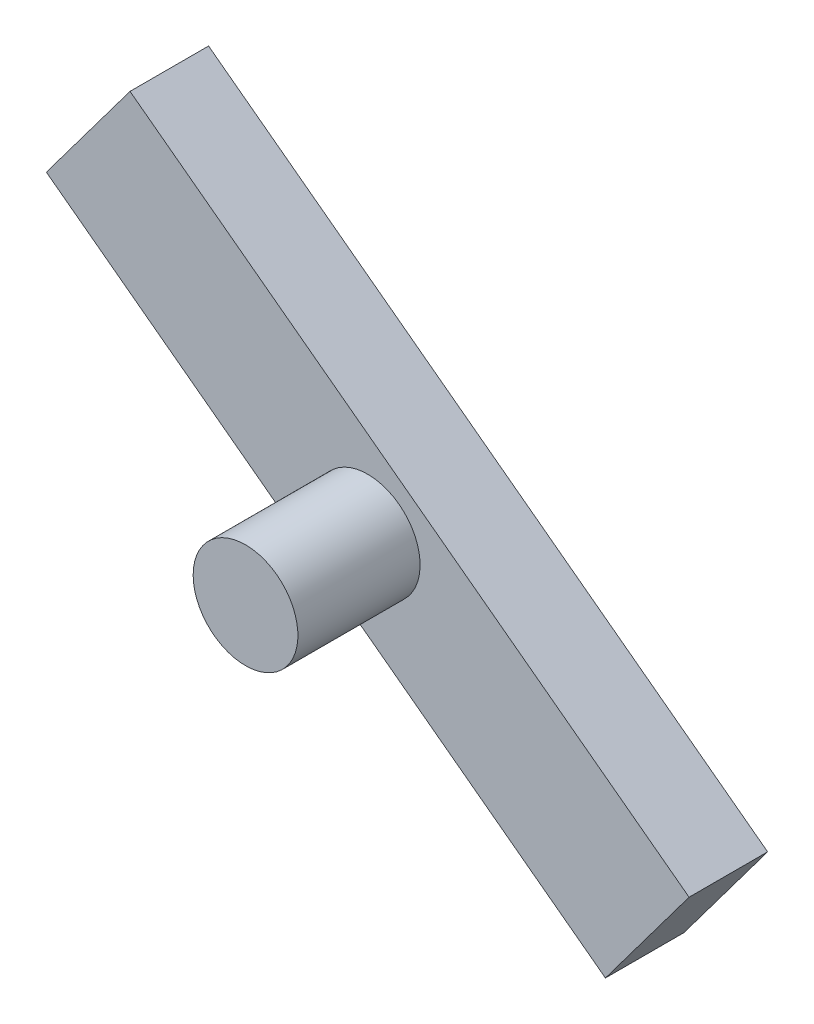
ISO-10303-21;
HEADER;
FILE_DESCRIPTION(('STEP AP214'),'2;1');
FILE_NAME('part.step','',(''),(''),'','','');
FILE_SCHEMA(('AUTOMOTIVE_DESIGN { 1 0 10303 214 1 1 1 1 }'));
ENDSEC;
DATA;
#1=APPLICATION_CONTEXT('core data for automotive mechanical design processes');
#2=APPLICATION_PROTOCOL_DEFINITION('international standard','automotive_design',2000,#1);
#3=PRODUCT_CONTEXT('',#1,'mechanical');
#4=PRODUCT('Part','Part','',(#3));
#5=PRODUCT_RELATED_PRODUCT_CATEGORY('part','',(#4));
#6=PRODUCT_DEFINITION_FORMATION('','',#4);
#7=PRODUCT_DEFINITION_CONTEXT('part definition',#1,'design');
#8=PRODUCT_DEFINITION('design','',#6,#7);
#9=PRODUCT_DEFINITION_SHAPE('','',#8);
#10=(LENGTH_UNIT() NAMED_UNIT(*) SI_UNIT(.MILLI.,.METRE.));
#11=(NAMED_UNIT(*) PLANE_ANGLE_UNIT() SI_UNIT($,.RADIAN.));
#12=(NAMED_UNIT(*) SI_UNIT($,.STERADIAN.) SOLID_ANGLE_UNIT());
#13=UNCERTAINTY_MEASURE_WITH_UNIT(LENGTH_MEASURE(1.E-05),#10,'distance_accuracy_value','');
#14=(GEOMETRIC_REPRESENTATION_CONTEXT(3) GLOBAL_UNCERTAINTY_ASSIGNED_CONTEXT((#13)) GLOBAL_UNIT_ASSIGNED_CONTEXT((#10,
#11,#12)) REPRESENTATION_CONTEXT('',''));
#15=CARTESIAN_POINT('',(0.,0.,0.));
#16=DIRECTION('',(0.,0.,1.));
#17=DIRECTION('',(1.,0.,0.));
#18=AXIS2_PLACEMENT_3D('',#15,#16,#17);
#19=CARTESIAN_POINT('',(-263.128358849387,316.504901667894,22.));
#20=DIRECTION('',(0.,0.,-1.));
#21=DIRECTION('',(-1.,0.,0.));
#22=AXIS2_PLACEMENT_3D('',#19,#20,#21);
#23=PLANE('',#22);
#24=CARTESIAN_POINT('',(-263.128358849387,316.504901667894,22.));
#25=DIRECTION('',(0.,0.,-1.));
#26=DIRECTION('',(-1.,0.,0.));
#27=AXIS2_PLACEMENT_3D('',#24,#25,#26);
#28=CIRCLE('',#27,3.);
#29=CARTESIAN_POINT('',(-266.128358849387,316.504901667894,22.));
#30=VERTEX_POINT('',#29);
#31=EDGE_CURVE('E47',#30,#30,#28,.T.);
#32=ORIENTED_EDGE('',*,*,#31,.F.);
#33=EDGE_LOOP('',(#32));
#34=FACE_BOUND('',#33,.T.);
#35=ADVANCED_FACE('F39',(#34),#23,.F.);
#36=CARTESIAN_POINT('',(-263.128358849387,316.504901667894,22.));
#37=DIRECTION('',(0.,0.,-1.));
#38=DIRECTION('',(-1.,0.,0.));
#39=AXIS2_PLACEMENT_3D('',#36,#37,#38);
#40=CYLINDRICAL_SURFACE('',#39,3.);
#41=CARTESIAN_POINT('',(-263.128358849387,316.504901667894,15.));
#42=DIRECTION('',(0.,0.,-1.));
#43=DIRECTION('',(-1.,0.,0.));
#44=AXIS2_PLACEMENT_3D('',#41,#42,#43);
#45=CIRCLE('',#44,3.);
#46=CARTESIAN_POINT('',(-266.128358849387,316.504901667894,15.));
#47=VERTEX_POINT('',#46);
#48=EDGE_CURVE('E12',#47,#47,#45,.T.);
#49=ORIENTED_EDGE('',*,*,#48,.F.);
#50=EDGE_LOOP('',(#49));
#51=FACE_BOUND('',#50,.T.);
#52=ORIENTED_EDGE('',*,*,#31,.T.);
#53=EDGE_LOOP('',(#52));
#54=FACE_BOUND('',#53,.T.);
#55=ADVANCED_FACE('F117',(#51,#54),#40,.T.);
#56=CARTESIAN_POINT('',(-281.537950913536,325.28481738683,15.));
#57=DIRECTION('',(0.599126640950297,0.800654275017385,0.));
#58=DIRECTION('',(-0.800654275017385,0.599126640950297,0.));
#59=AXIS2_PLACEMENT_3D('',#56,#57,#58);
#60=PLANE('',#59);
#61=DIRECTION('',(0.800654275017385,-0.599126640950297,0.));
#62=VECTOR('',#61,1.);
#63=CARTESIAN_POINT('',(-281.537950913536,325.28481738683,10.5));
#64=LINE('',#63,#62);
#65=CARTESIAN_POINT('',(-281.537950913536,325.28481738683,10.5));
#66=VERTEX_POINT('',#65);
#67=CARTESIAN_POINT('',(-249.51177991284,301.319751748818,10.5));
#68=VERTEX_POINT('',#67);
#69=EDGE_CURVE('E106',#66,#68,#64,.T.);
#70=ORIENTED_EDGE('',*,*,#69,.T.);
#71=DIRECTION('',(0.,0.,-1.));
#72=VECTOR('',#71,1.);
#73=CARTESIAN_POINT('',(-249.51177991284,301.319751748818,15.));
#74=LINE('',#73,#72);
#75=CARTESIAN_POINT('',(-249.51177991284,301.319751748818,15.));
#76=VERTEX_POINT('',#75);
#77=EDGE_CURVE('E97',#76,#68,#74,.T.);
#78=ORIENTED_EDGE('',*,*,#77,.F.);
#79=DIRECTION('',(0.800654275017385,-0.599126640950297,0.));
#80=VECTOR('',#79,1.);
#81=CARTESIAN_POINT('',(-281.537950913536,325.28481738683,15.));
#82=LINE('',#81,#80);
#83=CARTESIAN_POINT('',(-281.537950913536,325.28481738683,15.));
#84=VERTEX_POINT('',#83);
#85=EDGE_CURVE('E91',#84,#76,#82,.T.);
#86=ORIENTED_EDGE('',*,*,#85,.F.);
#87=DIRECTION('',(0.,0.,-1.));
#88=VECTOR('',#87,1.);
#89=CARTESIAN_POINT('',(-281.537950913536,325.28481738683,15.));
#90=LINE('',#89,#88);
#91=EDGE_CURVE('E102',#84,#66,#90,.T.);
#92=ORIENTED_EDGE('',*,*,#91,.T.);
#93=EDGE_LOOP('',(#70,#78,#86,#92));
#94=FACE_BOUND('',#93,.T.);
#95=ADVANCED_FACE('F120',(#94),#60,.F.);
#96=CARTESIAN_POINT('',(-249.51177991284,301.319751748818,15.));
#97=DIRECTION('',(-0.800654275017387,0.599126640950294,0.));
#98=DIRECTION('',(-0.599126640950294,-0.800654275017387,0.));
#99=AXIS2_PLACEMENT_3D('',#96,#97,#98);
#100=PLANE('',#99);
#101=DIRECTION('',(0.599126640950294,0.800654275017387,0.));
#102=VECTOR('',#101,1.);
#103=CARTESIAN_POINT('',(-249.51177991284,301.319751748818,10.5));
#104=LINE('',#103,#102);
#105=CARTESIAN_POINT('',(-244.718766785238,307.724985948958,10.5));
#106=VERTEX_POINT('',#105);
#107=EDGE_CURVE('E96',#68,#106,#104,.T.);
#108=ORIENTED_EDGE('',*,*,#107,.T.);
#109=DIRECTION('',(0.,0.,-1.));
#110=VECTOR('',#109,1.);
#111=CARTESIAN_POINT('',(-244.718766785238,307.724985948958,15.));
#112=LINE('',#111,#110);
#113=CARTESIAN_POINT('',(-244.718766785238,307.724985948958,15.));
#114=VERTEX_POINT('',#113);
#115=EDGE_CURVE('E94',#114,#106,#112,.T.);
#116=ORIENTED_EDGE('',*,*,#115,.F.);
#117=DIRECTION('',(0.599126640950294,0.800654275017387,0.));
#118=VECTOR('',#117,1.);
#119=CARTESIAN_POINT('',(-249.51177991284,301.319751748818,15.));
#120=LINE('',#119,#118);
#121=EDGE_CURVE('E86',#76,#114,#120,.T.);
#122=ORIENTED_EDGE('',*,*,#121,.F.);
#123=ORIENTED_EDGE('',*,*,#77,.T.);
#124=EDGE_LOOP('',(#108,#116,#122,#123));
#125=FACE_BOUND('',#124,.T.);
#126=ADVANCED_FACE('F95',(#125),#100,.F.);
#127=CARTESIAN_POINT('',(-244.718766785238,307.724985948958,15.));
#128=DIRECTION('',(-0.599126640950298,-0.800654275017384,0.));
#129=DIRECTION('',(0.800654275017384,-0.599126640950298,0.));
#130=AXIS2_PLACEMENT_3D('',#127,#128,#129);
#131=PLANE('',#130);
#132=DIRECTION('',(-0.800654275017384,0.599126640950298,0.));
#133=VECTOR('',#132,1.);
#134=CARTESIAN_POINT('',(-244.718766785238,307.724985948958,10.5));
#135=LINE('',#134,#133);
#136=CARTESIAN_POINT('',(-276.744937785933,331.690051586969,10.5));
#137=VERTEX_POINT('',#136);
#138=EDGE_CURVE('E72',#106,#137,#135,.T.);
#139=ORIENTED_EDGE('',*,*,#138,.T.);
#140=DIRECTION('',(0.,0.,-1.));
#141=VECTOR('',#140,1.);
#142=CARTESIAN_POINT('',(-276.744937785933,331.690051586969,15.));
#143=LINE('',#142,#141);
#144=CARTESIAN_POINT('',(-276.744937785933,331.690051586969,15.));
#145=VERTEX_POINT('',#144);
#146=EDGE_CURVE('E98',#145,#137,#143,.T.);
#147=ORIENTED_EDGE('',*,*,#146,.F.);
#148=DIRECTION('',(-0.800654275017384,0.599126640950298,0.));
#149=VECTOR('',#148,1.);
#150=CARTESIAN_POINT('',(-244.718766785238,307.724985948958,15.));
#151=LINE('',#150,#149);
#152=EDGE_CURVE('E89',#114,#145,#151,.T.);
#153=ORIENTED_EDGE('',*,*,#152,.F.);
#154=ORIENTED_EDGE('',*,*,#115,.T.);
#155=EDGE_LOOP('',(#139,#147,#153,#154));
#156=FACE_BOUND('',#155,.T.);
#157=ADVANCED_FACE('F100',(#156),#131,.F.);
#158=CARTESIAN_POINT('',(-276.744937785933,331.690051586969,15.));
#159=DIRECTION('',(0.800654275017386,-0.599126640950296,0.));
#160=DIRECTION('',(0.599126640950296,0.800654275017386,0.));
#161=AXIS2_PLACEMENT_3D('',#158,#159,#160);
#162=PLANE('',#161);
#163=DIRECTION('',(-0.599126640950296,-0.800654275017386,0.));
#164=VECTOR('',#163,1.);
#165=CARTESIAN_POINT('',(-276.744937785933,331.690051586969,10.5));
#166=LINE('',#165,#164);
#167=EDGE_CURVE('E78',#137,#66,#166,.T.);
#168=ORIENTED_EDGE('',*,*,#167,.T.);
#169=ORIENTED_EDGE('',*,*,#91,.F.);
#170=DIRECTION('',(-0.599126640950296,-0.800654275017386,0.));
#171=VECTOR('',#170,1.);
#172=CARTESIAN_POINT('',(-276.744937785933,331.690051586969,15.));
#173=LINE('',#172,#171);
#174=EDGE_CURVE('E55',#145,#84,#173,.T.);
#175=ORIENTED_EDGE('',*,*,#174,.F.);
#176=ORIENTED_EDGE('',*,*,#146,.T.);
#177=EDGE_LOOP('',(#168,#169,#175,#176));
#178=FACE_BOUND('',#177,.T.);
#179=ADVANCED_FACE('F135',(#178),#162,.F.);
#180=CARTESIAN_POINT('',(0.,0.,15.));
#181=DIRECTION('',(0.,0.,1.));
#182=DIRECTION('',(1.,0.,0.));
#183=AXIS2_PLACEMENT_3D('',#180,#181,#182);
#184=PLANE('',#183);
#185=ORIENTED_EDGE('',*,*,#48,.T.);
#186=EDGE_LOOP('',(#185));
#187=FACE_BOUND('',#186,.T.);
#188=ORIENTED_EDGE('',*,*,#85,.T.);
#189=ORIENTED_EDGE('',*,*,#121,.T.);
#190=ORIENTED_EDGE('',*,*,#152,.T.);
#191=ORIENTED_EDGE('',*,*,#174,.T.);
#192=EDGE_LOOP('',(#188,#189,#190,#191));
#193=FACE_BOUND('',#192,.T.);
#194=ADVANCED_FACE('F87',(#187,#193),#184,.T.);
#195=CARTESIAN_POINT('',(0.,0.,10.5));
#196=DIRECTION('',(0.,0.,1.));
#197=DIRECTION('',(1.,0.,0.));
#198=AXIS2_PLACEMENT_3D('',#195,#196,#197);
#199=PLANE('',#198);
#200=ORIENTED_EDGE('',*,*,#69,.F.);
#201=ORIENTED_EDGE('',*,*,#167,.F.);
#202=ORIENTED_EDGE('',*,*,#138,.F.);
#203=ORIENTED_EDGE('',*,*,#107,.F.);
#204=EDGE_LOOP('',(#200,#201,#202,#203));
#205=FACE_BOUND('',#204,.T.);
#206=ADVANCED_FACE('F138',(#205),#199,.F.);
#207=CLOSED_SHELL('',(#35,#55,#95,#126,#157,#179,#194,#206));
#208=MANIFOLD_SOLID_BREP('B2',#207);
#209=ADVANCED_BREP_SHAPE_REPRESENTATION('',(#18,#208),#14);
#210=SHAPE_DEFINITION_REPRESENTATION(#9,#209);
ENDSEC;
END-ISO-10303-21;
